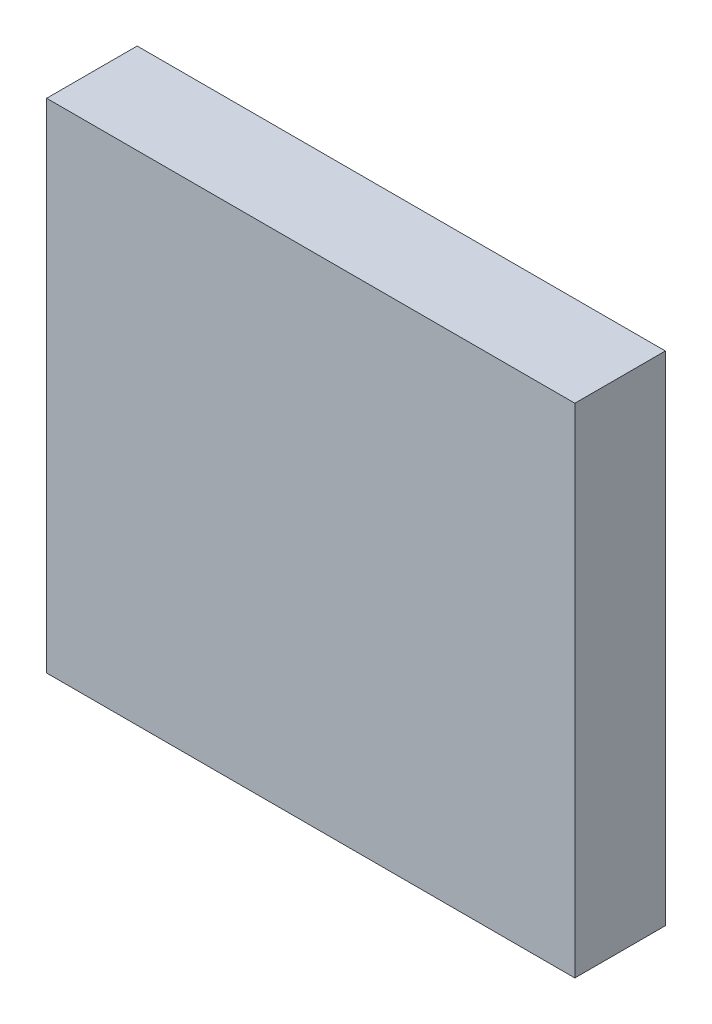
ISO-10303-21;
HEADER;
FILE_DESCRIPTION(('STEP AP214'),'2;1');
FILE_NAME('part.step','',(''),(''),'','','');
FILE_SCHEMA(('AUTOMOTIVE_DESIGN { 1 0 10303 214 1 1 1 1 }'));
ENDSEC;
DATA;
#1=APPLICATION_CONTEXT('core data for automotive mechanical design processes');
#2=APPLICATION_PROTOCOL_DEFINITION('international standard','automotive_design',2000,#1);
#3=PRODUCT_CONTEXT('',#1,'mechanical');
#4=PRODUCT('Part','Part','',(#3));
#5=PRODUCT_RELATED_PRODUCT_CATEGORY('part','',(#4));
#6=PRODUCT_DEFINITION_FORMATION('','',#4);
#7=PRODUCT_DEFINITION_CONTEXT('part definition',#1,'design');
#8=PRODUCT_DEFINITION('design','',#6,#7);
#9=PRODUCT_DEFINITION_SHAPE('','',#8);
#10=(LENGTH_UNIT() NAMED_UNIT(*) SI_UNIT(.MILLI.,.METRE.));
#11=(NAMED_UNIT(*) PLANE_ANGLE_UNIT() SI_UNIT($,.RADIAN.));
#12=(NAMED_UNIT(*) SI_UNIT($,.STERADIAN.) SOLID_ANGLE_UNIT());
#13=UNCERTAINTY_MEASURE_WITH_UNIT(LENGTH_MEASURE(1.E-05),#10,'distance_accuracy_value','');
#14=(GEOMETRIC_REPRESENTATION_CONTEXT(3) GLOBAL_UNCERTAINTY_ASSIGNED_CONTEXT((#13)) GLOBAL_UNIT_ASSIGNED_CONTEXT((#10,
#11,#12)) REPRESENTATION_CONTEXT('',''));
#15=CARTESIAN_POINT('',(0.,0.,0.));
#16=DIRECTION('',(0.,0.,1.));
#17=DIRECTION('',(1.,0.,0.));
#18=AXIS2_PLACEMENT_3D('',#15,#16,#17);
#19=CARTESIAN_POINT('',(-0.168055,0.,1.));
#20=DIRECTION('',(0.,0.,1.));
#21=DIRECTION('',(1.,0.,0.));
#22=AXIS2_PLACEMENT_3D('',#19,#20,#21);
#23=PLANE('',#22);
#24=DIRECTION('',(1.,0.,0.));
#25=VECTOR('',#24,1.);
#26=CARTESIAN_POINT('',(-3.0861,-2.74999,1.));
#27=LINE('',#26,#25);
#28=CARTESIAN_POINT('',(-3.0861,-2.74999,1.));
#29=VERTEX_POINT('',#28);
#30=CARTESIAN_POINT('',(2.74999,-2.74999,1.));
#31=VERTEX_POINT('',#30);
#32=EDGE_CURVE('E80',#29,#31,#27,.T.);
#33=ORIENTED_EDGE('',*,*,#32,.T.);
#34=DIRECTION('',(0.,1.,0.));
#35=VECTOR('',#34,1.);
#36=CARTESIAN_POINT('',(2.74999,-2.74999,1.));
#37=LINE('',#36,#35);
#38=CARTESIAN_POINT('',(2.74999,2.74999,1.));
#39=VERTEX_POINT('',#38);
#40=EDGE_CURVE('E85',#31,#39,#37,.T.);
#41=ORIENTED_EDGE('',*,*,#40,.T.);
#42=DIRECTION('',(-1.,0.,0.));
#43=VECTOR('',#42,1.);
#44=CARTESIAN_POINT('',(2.74999,2.74999,1.));
#45=LINE('',#44,#43);
#46=CARTESIAN_POINT('',(-3.0861,2.74999,1.));
#47=VERTEX_POINT('',#46);
#48=EDGE_CURVE('E102',#39,#47,#45,.T.);
#49=ORIENTED_EDGE('',*,*,#48,.T.);
#50=DIRECTION('',(0.,-1.,0.));
#51=VECTOR('',#50,1.);
#52=CARTESIAN_POINT('',(-3.0861,2.74999,1.));
#53=LINE('',#52,#51);
#54=EDGE_CURVE('E11',#47,#29,#53,.T.);
#55=ORIENTED_EDGE('',*,*,#54,.T.);
#56=EDGE_LOOP('',(#33,#41,#49,#55));
#57=FACE_BOUND('',#56,.T.);
#58=ADVANCED_FACE('F16',(#57),#23,.T.);
#59=CARTESIAN_POINT('',(-0.168055,0.,0.));
#60=DIRECTION('',(0.,0.,1.));
#61=DIRECTION('',(1.,0.,0.));
#62=AXIS2_PLACEMENT_3D('',#59,#60,#61);
#63=PLANE('',#62);
#64=DIRECTION('',(1.,0.,0.));
#65=VECTOR('',#64,1.);
#66=CARTESIAN_POINT('',(-3.0861,-2.74999,0.));
#67=LINE('',#66,#65);
#68=CARTESIAN_POINT('',(-3.0861,-2.74999,0.));
#69=VERTEX_POINT('',#68);
#70=CARTESIAN_POINT('',(2.74999,-2.74999,0.));
#71=VERTEX_POINT('',#70);
#72=EDGE_CURVE('E71',#69,#71,#67,.T.);
#73=ORIENTED_EDGE('',*,*,#72,.F.);
#74=DIRECTION('',(0.,-1.,0.));
#75=VECTOR('',#74,1.);
#76=CARTESIAN_POINT('',(-3.0861,2.74999,0.));
#77=LINE('',#76,#75);
#78=CARTESIAN_POINT('',(-3.0861,2.74999,0.));
#79=VERTEX_POINT('',#78);
#80=EDGE_CURVE('E27',#79,#69,#77,.T.);
#81=ORIENTED_EDGE('',*,*,#80,.F.);
#82=DIRECTION('',(-1.,0.,0.));
#83=VECTOR('',#82,1.);
#84=CARTESIAN_POINT('',(2.74999,2.74999,0.));
#85=LINE('',#84,#83);
#86=CARTESIAN_POINT('',(2.74999,2.74999,0.));
#87=VERTEX_POINT('',#86);
#88=EDGE_CURVE('E74',#87,#79,#85,.T.);
#89=ORIENTED_EDGE('',*,*,#88,.F.);
#90=DIRECTION('',(0.,1.,0.));
#91=VECTOR('',#90,1.);
#92=CARTESIAN_POINT('',(2.74999,-2.74999,0.));
#93=LINE('',#92,#91);
#94=EDGE_CURVE('E67',#71,#87,#93,.T.);
#95=ORIENTED_EDGE('',*,*,#94,.F.);
#96=EDGE_LOOP('',(#73,#81,#89,#95));
#97=FACE_BOUND('',#96,.T.);
#98=ADVANCED_FACE('F69',(#97),#63,.F.);
#99=CARTESIAN_POINT('',(-3.0861,2.74999,0.));
#100=DIRECTION('',(1.,0.,0.));
#101=DIRECTION('',(0.,1.,0.));
#102=AXIS2_PLACEMENT_3D('',#99,#100,#101);
#103=PLANE('',#102);
#104=DIRECTION('',(0.,0.,1.));
#105=VECTOR('',#104,1.);
#106=CARTESIAN_POINT('',(-3.0861,2.74999,0.));
#107=LINE('',#106,#105);
#108=EDGE_CURVE('E98',#79,#47,#107,.T.);
#109=ORIENTED_EDGE('',*,*,#108,.F.);
#110=ORIENTED_EDGE('',*,*,#80,.T.);
#111=DIRECTION('',(0.,0.,1.));
#112=VECTOR('',#111,1.);
#113=CARTESIAN_POINT('',(-3.0861,-2.74999,0.));
#114=LINE('',#113,#112);
#115=EDGE_CURVE('E20',#69,#29,#114,.T.);
#116=ORIENTED_EDGE('',*,*,#115,.T.);
#117=ORIENTED_EDGE('',*,*,#54,.F.);
#118=EDGE_LOOP('',(#109,#110,#116,#117));
#119=FACE_BOUND('',#118,.T.);
#120=ADVANCED_FACE('F116',(#119),#103,.F.);
#121=CARTESIAN_POINT('',(2.74999,2.74999,0.));
#122=DIRECTION('',(0.,-1.,0.));
#123=DIRECTION('',(0.,0.,-1.));
#124=AXIS2_PLACEMENT_3D('',#121,#122,#123);
#125=PLANE('',#124);
#126=DIRECTION('',(0.,0.,1.));
#127=VECTOR('',#126,1.);
#128=CARTESIAN_POINT('',(2.74999,2.74999,0.));
#129=LINE('',#128,#127);
#130=EDGE_CURVE('E79',#87,#39,#129,.T.);
#131=ORIENTED_EDGE('',*,*,#130,.F.);
#132=ORIENTED_EDGE('',*,*,#88,.T.);
#133=ORIENTED_EDGE('',*,*,#108,.T.);
#134=ORIENTED_EDGE('',*,*,#48,.F.);
#135=EDGE_LOOP('',(#131,#132,#133,#134));
#136=FACE_BOUND('',#135,.T.);
#137=ADVANCED_FACE('F115',(#136),#125,.F.);
#138=CARTESIAN_POINT('',(2.74999,-2.74999,0.));
#139=DIRECTION('',(-1.,0.,0.));
#140=DIRECTION('',(0.,0.,1.));
#141=AXIS2_PLACEMENT_3D('',#138,#139,#140);
#142=PLANE('',#141);
#143=DIRECTION('',(0.,0.,1.));
#144=VECTOR('',#143,1.);
#145=CARTESIAN_POINT('',(2.74999,-2.74999,0.));
#146=LINE('',#145,#144);
#147=EDGE_CURVE('E83',#71,#31,#146,.T.);
#148=ORIENTED_EDGE('',*,*,#147,.F.);
#149=ORIENTED_EDGE('',*,*,#94,.T.);
#150=ORIENTED_EDGE('',*,*,#130,.T.);
#151=ORIENTED_EDGE('',*,*,#40,.F.);
#152=EDGE_LOOP('',(#148,#149,#150,#151));
#153=FACE_BOUND('',#152,.T.);
#154=ADVANCED_FACE('F18',(#153),#142,.F.);
#155=CARTESIAN_POINT('',(-3.0861,-2.74999,0.));
#156=DIRECTION('',(0.,1.,0.));
#157=DIRECTION('',(1.,0.,0.));
#158=AXIS2_PLACEMENT_3D('',#155,#156,#157);
#159=PLANE('',#158);
#160=ORIENTED_EDGE('',*,*,#115,.F.);
#161=ORIENTED_EDGE('',*,*,#72,.T.);
#162=ORIENTED_EDGE('',*,*,#147,.T.);
#163=ORIENTED_EDGE('',*,*,#32,.F.);
#164=EDGE_LOOP('',(#160,#161,#162,#163));
#165=FACE_BOUND('',#164,.T.);
#166=ADVANCED_FACE('F91',(#165),#159,.F.);
#167=CLOSED_SHELL('',(#58,#98,#120,#137,#154,#166));
#168=MANIFOLD_SOLID_BREP('B1',#167);
#169=ADVANCED_BREP_SHAPE_REPRESENTATION('',(#18,#168),#14);
#170=SHAPE_DEFINITION_REPRESENTATION(#9,#169);
ENDSEC;
END-ISO-10303-21;
